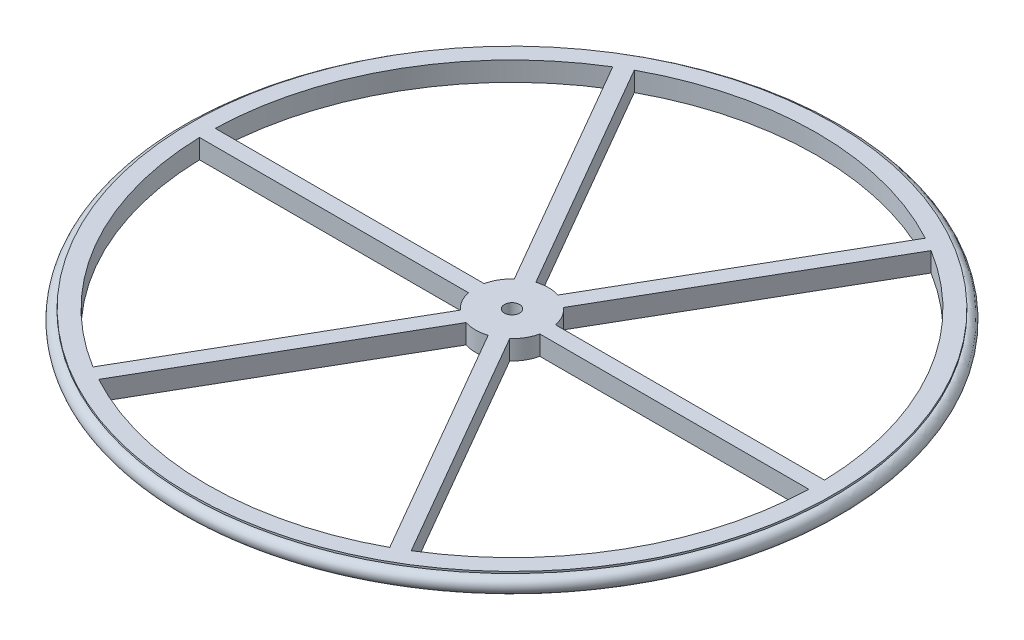
ISO-10303-21;
HEADER;
FILE_DESCRIPTION(('STEP AP214'),'2;1');
FILE_NAME('part.step','',(''),(''),'','','');
FILE_SCHEMA(('AUTOMOTIVE_DESIGN { 1 0 10303 214 1 1 1 1 }'));
ENDSEC;
DATA;
#1=APPLICATION_CONTEXT('core data for automotive mechanical design processes');
#2=APPLICATION_PROTOCOL_DEFINITION('international standard','automotive_design',2000,#1);
#3=PRODUCT_CONTEXT('',#1,'mechanical');
#4=PRODUCT('Part','Part','',(#3));
#5=PRODUCT_RELATED_PRODUCT_CATEGORY('part','',(#4));
#6=PRODUCT_DEFINITION_FORMATION('','',#4);
#7=PRODUCT_DEFINITION_CONTEXT('part definition',#1,'design');
#8=PRODUCT_DEFINITION('design','',#6,#7);
#9=PRODUCT_DEFINITION_SHAPE('','',#8);
#10=(LENGTH_UNIT() NAMED_UNIT(*) SI_UNIT(.MILLI.,.METRE.));
#11=(NAMED_UNIT(*) PLANE_ANGLE_UNIT() SI_UNIT($,.RADIAN.));
#12=(NAMED_UNIT(*) SI_UNIT($,.STERADIAN.) SOLID_ANGLE_UNIT());
#13=UNCERTAINTY_MEASURE_WITH_UNIT(LENGTH_MEASURE(1.E-05),#10,'distance_accuracy_value','');
#14=(GEOMETRIC_REPRESENTATION_CONTEXT(3) GLOBAL_UNCERTAINTY_ASSIGNED_CONTEXT((#13)) GLOBAL_UNIT_ASSIGNED_CONTEXT((#10,
#11,#12)) REPRESENTATION_CONTEXT('',''));
#15=CARTESIAN_POINT('',(0.,0.,0.));
#16=DIRECTION('',(0.,0.,1.));
#17=DIRECTION('',(1.,0.,0.));
#18=AXIS2_PLACEMENT_3D('',#15,#16,#17);
#19=CARTESIAN_POINT('',(0.,10.6,0.));
#20=DIRECTION('',(0.,-1.,0.));
#21=DIRECTION('',(0.,0.,-1.));
#22=AXIS2_PLACEMENT_3D('',#19,#20,#21);
#23=CYLINDRICAL_SURFACE('',#22,175.7);
#24=CARTESIAN_POINT('',(0.,0.999999999999997,0.));
#25=DIRECTION('',(0.,1.,0.));
#26=DIRECTION('',(0.,0.,1.));
#27=AXIS2_PLACEMENT_3D('',#24,#25,#26);
#28=CIRCLE('',#27,175.7);
#29=CARTESIAN_POINT('',(0.,0.999999999999997,175.7));
#30=VERTEX_POINT('',#29);
#31=EDGE_CURVE('E236',#30,#30,#28,.F.);
#32=ORIENTED_EDGE('',*,*,#31,.T.);
#33=EDGE_LOOP('',(#32));
#34=FACE_BOUND('',#33,.T.);
#35=CARTESIAN_POINT('',(0.,0.,0.));
#36=DIRECTION('',(0.,1.,0.));
#37=DIRECTION('',(0.,0.,1.));
#38=AXIS2_PLACEMENT_3D('',#35,#36,#37);
#39=CIRCLE('',#38,175.7);
#40=CARTESIAN_POINT('',(0.,0.,175.7));
#41=VERTEX_POINT('',#40);
#42=EDGE_CURVE('E43',#41,#41,#39,.T.);
#43=ORIENTED_EDGE('',*,*,#42,.T.);
#44=EDGE_LOOP('',(#43));
#45=FACE_BOUND('',#44,.T.);
#46=ADVANCED_FACE('F39',(#34,#45),#23,.T.);
#47=CARTESIAN_POINT('',(0.,10.6,0.));
#48=DIRECTION('',(0.,1.,0.));
#49=DIRECTION('',(0.,0.,1.));
#50=AXIS2_PLACEMENT_3D('',#47,#48,#49);
#51=PLANE('',#50);
#52=CARTESIAN_POINT('',(0.,10.6,0.));
#53=DIRECTION('',(0.,1.,0.));
#54=DIRECTION('',(0.,0.,1.));
#55=AXIS2_PLACEMENT_3D('',#52,#53,#54);
#56=CIRCLE('',#55,175.7);
#57=CARTESIAN_POINT('',(0.,10.6,175.7));
#58=VERTEX_POINT('',#57);
#59=EDGE_CURVE('E11',#58,#58,#56,.T.);
#60=ORIENTED_EDGE('',*,*,#59,.T.);
#61=EDGE_LOOP('',(#60));
#62=FACE_BOUND('',#61,.T.);
#63=CARTESIAN_POINT('',(0.,10.6,0.));
#64=DIRECTION('',(0.,1.,0.));
#65=DIRECTION('',(0.,0.,1.));
#66=AXIS2_PLACEMENT_3D('',#63,#64,#65);
#67=CIRCLE('',#66,4.125);
#68=CARTESIAN_POINT('',(0.,10.6,4.125));
#69=VERTEX_POINT('',#68);
#70=EDGE_CURVE('E467',#69,#69,#67,.T.);
#71=ORIENTED_EDGE('',*,*,#70,.F.);
#72=EDGE_LOOP('',(#71));
#73=FACE_BOUND('',#72,.T.);
#74=DIRECTION('',(-0.5,0.,-0.866025403784439));
#75=VECTOR('',#74,1.);
#76=CARTESIAN_POINT('',(-13.4900497226679,10.6,-14.7654515162912));
#77=LINE('',#76,#75);
#78=CARTESIAN_POINT('',(-13.4900497226679,10.6,-14.7654515162912));
#79=VERTEX_POINT('',#78);
#80=CARTESIAN_POINT('',(-86.9239092362731,10.6,-141.956627189731));
#81=VERTEX_POINT('',#80);
#82=EDGE_CURVE('E427',#79,#81,#77,.T.);
#83=ORIENTED_EDGE('',*,*,#82,.F.);
#84=CARTESIAN_POINT('',(0.,10.6,0.));
#85=DIRECTION('',(0.,-1.,0.));
#86=DIRECTION('',(0.,0.,1.));
#87=AXIS2_PLACEMENT_3D('',#84,#85,#86);
#88=CIRCLE('',#87,20.);
#89=CARTESIAN_POINT('',(-19.5322809727896,10.6,-4.3));
#90=VERTEX_POINT('',#89);
#91=EDGE_CURVE('E424',#90,#79,#88,.T.);
#92=ORIENTED_EDGE('',*,*,#91,.F.);
#93=DIRECTION('',(1.,0.,0.));
#94=VECTOR('',#93,1.);
#95=CARTESIAN_POINT('',(-19.5322809727896,10.6,-4.3));
#96=LINE('',#95,#94);
#97=CARTESIAN_POINT('',(-166.4,10.6,-4.3));
#98=VERTEX_POINT('',#97);
#99=EDGE_CURVE('E435',#98,#90,#96,.T.);
#100=ORIENTED_EDGE('',*,*,#99,.F.);
#101=CARTESIAN_POINT('',(0.,10.6,0.));
#102=DIRECTION('',(0.,1.,0.));
#103=DIRECTION('',(0.,0.,1.));
#104=AXIS2_PLACEMENT_3D('',#101,#102,#103);
#105=CIRCLE('',#104,166.455549622114);
#106=EDGE_CURVE('E431',#81,#98,#105,.T.);
#107=ORIENTED_EDGE('',*,*,#106,.F.);
#108=EDGE_LOOP('',(#83,#92,#100,#107));
#109=FACE_BOUND('',#108,.T.);
#110=DIRECTION('',(-1.,0.,0.));
#111=VECTOR('',#110,1.);
#112=CARTESIAN_POINT('',(-19.5322809727896,10.6,4.3));
#113=LINE('',#112,#111);
#114=CARTESIAN_POINT('',(-19.5322809727896,10.6,4.3));
#115=VERTEX_POINT('',#114);
#116=CARTESIAN_POINT('',(-166.4,10.6,4.3));
#117=VERTEX_POINT('',#116);
#118=EDGE_CURVE('E384',#115,#117,#113,.T.);
#119=ORIENTED_EDGE('',*,*,#118,.F.);
#120=CARTESIAN_POINT('',(0.,10.6,0.));
#121=DIRECTION('',(0.,-1.,0.));
#122=DIRECTION('',(0.,0.,1.));
#123=AXIS2_PLACEMENT_3D('',#120,#121,#122);
#124=CIRCLE('',#123,20.);
#125=CARTESIAN_POINT('',(-13.4900497226679,10.6,14.7654515162913));
#126=VERTEX_POINT('',#125);
#127=EDGE_CURVE('E381',#126,#115,#124,.T.);
#128=ORIENTED_EDGE('',*,*,#127,.F.);
#129=DIRECTION('',(0.499999999999999,0.,-0.866025403784439));
#130=VECTOR('',#129,1.);
#131=CARTESIAN_POINT('',(-13.4900497226679,10.6,14.7654515162913));
#132=LINE('',#131,#130);
#133=CARTESIAN_POINT('',(-86.9239092362729,10.6,141.956627189731));
#134=VERTEX_POINT('',#133);
#135=EDGE_CURVE('E392',#134,#126,#132,.T.);
#136=ORIENTED_EDGE('',*,*,#135,.F.);
#137=CARTESIAN_POINT('',(0.,10.6,0.));
#138=DIRECTION('',(0.,1.,0.));
#139=DIRECTION('',(0.,0.,1.));
#140=AXIS2_PLACEMENT_3D('',#137,#138,#139);
#141=CIRCLE('',#140,166.455549622114);
#142=EDGE_CURVE('E388',#117,#134,#141,.T.);
#143=ORIENTED_EDGE('',*,*,#142,.F.);
#144=EDGE_LOOP('',(#119,#128,#136,#143));
#145=FACE_BOUND('',#144,.T.);
#146=DIRECTION('',(0.5,0.,-0.866025403784439));
#147=VECTOR('',#146,1.);
#148=CARTESIAN_POINT('',(6.04223125012173,10.6,-19.0654515162913));
#149=LINE('',#148,#147);
#150=CARTESIAN_POINT('',(6.04223125012173,10.6,-19.0654515162913));
#151=VERTEX_POINT('',#150);
#152=CARTESIAN_POINT('',(79.4760907637269,10.6,-146.256627189731));
#153=VERTEX_POINT('',#152);
#154=EDGE_CURVE('E341',#151,#153,#149,.T.);
#155=ORIENTED_EDGE('',*,*,#154,.F.);
#156=CARTESIAN_POINT('',(0.,10.6,0.));
#157=DIRECTION('',(0.,-1.,0.));
#158=DIRECTION('',(0.,0.,1.));
#159=AXIS2_PLACEMENT_3D('',#156,#157,#158);
#160=CIRCLE('',#159,20.);
#161=CARTESIAN_POINT('',(-6.04223125012173,10.6,-19.0654515162913));
#162=VERTEX_POINT('',#161);
#163=EDGE_CURVE('E338',#162,#151,#160,.T.);
#164=ORIENTED_EDGE('',*,*,#163,.F.);
#165=DIRECTION('',(0.5,0.,0.866025403784439));
#166=VECTOR('',#165,1.);
#167=CARTESIAN_POINT('',(-6.04223125012173,10.6,-19.0654515162913));
#168=LINE('',#167,#166);
#169=CARTESIAN_POINT('',(-79.4760907637269,10.6,-146.256627189731));
#170=VERTEX_POINT('',#169);
#171=EDGE_CURVE('E349',#170,#162,#168,.T.);
#172=ORIENTED_EDGE('',*,*,#171,.F.);
#173=CARTESIAN_POINT('',(0.,10.6,0.));
#174=DIRECTION('',(0.,1.,0.));
#175=DIRECTION('',(0.,0.,1.));
#176=AXIS2_PLACEMENT_3D('',#173,#174,#175);
#177=CIRCLE('',#176,166.455549622114);
#178=EDGE_CURVE('E345',#153,#170,#177,.T.);
#179=ORIENTED_EDGE('',*,*,#178,.F.);
#180=EDGE_LOOP('',(#155,#164,#172,#179));
#181=FACE_BOUND('',#180,.T.);
#182=DIRECTION('',(-0.5,0.,0.866025403784439));
#183=VECTOR('',#182,1.);
#184=CARTESIAN_POINT('',(13.4900497226679,10.6,-14.7654515162913));
#185=LINE('',#184,#183);
#186=CARTESIAN_POINT('',(86.9239092362731,10.6,-141.956627189731));
#187=VERTEX_POINT('',#186);
#188=CARTESIAN_POINT('',(13.4900497226679,10.6,-14.7654515162913));
#189=VERTEX_POINT('',#188);
#190=EDGE_CURVE('E298',#187,#189,#185,.T.);
#191=ORIENTED_EDGE('',*,*,#190,.F.);
#192=CARTESIAN_POINT('',(0.,10.6,0.));
#193=DIRECTION('',(0.,1.,0.));
#194=DIRECTION('',(0.,0.,-1.));
#195=AXIS2_PLACEMENT_3D('',#192,#193,#194);
#196=CIRCLE('',#195,166.455549622114);
#197=CARTESIAN_POINT('',(166.4,10.6,-4.30000000000002));
#198=VERTEX_POINT('',#197);
#199=EDGE_CURVE('E295',#198,#187,#196,.T.);
#200=ORIENTED_EDGE('',*,*,#199,.F.);
#201=DIRECTION('',(1.,0.,0.));
#202=VECTOR('',#201,1.);
#203=CARTESIAN_POINT('',(19.5322809727896,10.6,-4.3));
#204=LINE('',#203,#202);
#205=CARTESIAN_POINT('',(19.5322809727896,10.6,-4.3));
#206=VERTEX_POINT('',#205);
#207=EDGE_CURVE('E306',#206,#198,#204,.T.);
#208=ORIENTED_EDGE('',*,*,#207,.F.);
#209=CARTESIAN_POINT('',(0.,10.6,0.));
#210=DIRECTION('',(0.,-1.,0.));
#211=DIRECTION('',(0.,0.,1.));
#212=AXIS2_PLACEMENT_3D('',#209,#210,#211);
#213=CIRCLE('',#212,20.);
#214=EDGE_CURVE('E302',#189,#206,#213,.T.);
#215=ORIENTED_EDGE('',*,*,#214,.F.);
#216=EDGE_LOOP('',(#191,#200,#208,#215));
#217=FACE_BOUND('',#216,.T.);
#218=DIRECTION('',(0.5,0.,0.866025403784438));
#219=VECTOR('',#218,1.);
#220=CARTESIAN_POINT('',(13.4900497226679,10.6,14.7654515162912));
#221=LINE('',#220,#219);
#222=CARTESIAN_POINT('',(13.4900497226679,10.6,14.7654515162912));
#223=VERTEX_POINT('',#222);
#224=CARTESIAN_POINT('',(86.9239092362732,10.6,141.956627189731));
#225=VERTEX_POINT('',#224);
#226=EDGE_CURVE('E255',#223,#225,#221,.T.);
#227=ORIENTED_EDGE('',*,*,#226,.F.);
#228=CARTESIAN_POINT('',(0.,10.6,0.));
#229=DIRECTION('',(0.,-1.,0.));
#230=DIRECTION('',(0.,0.,1.));
#231=AXIS2_PLACEMENT_3D('',#228,#229,#230);
#232=CIRCLE('',#231,20.);
#233=CARTESIAN_POINT('',(19.5322809727896,10.6,4.3));
#234=VERTEX_POINT('',#233);
#235=EDGE_CURVE('E252',#234,#223,#232,.T.);
#236=ORIENTED_EDGE('',*,*,#235,.F.);
#237=DIRECTION('',(-1.,0.,0.));
#238=VECTOR('',#237,1.);
#239=CARTESIAN_POINT('',(19.5322809727896,10.6,4.3));
#240=LINE('',#239,#238);
#241=CARTESIAN_POINT('',(166.4,10.6,4.29999999999998));
#242=VERTEX_POINT('',#241);
#243=EDGE_CURVE('E263',#242,#234,#240,.T.);
#244=ORIENTED_EDGE('',*,*,#243,.F.);
#245=CARTESIAN_POINT('',(0.,10.6,0.));
#246=DIRECTION('',(0.,1.,0.));
#247=DIRECTION('',(0.,0.,-1.));
#248=AXIS2_PLACEMENT_3D('',#245,#246,#247);
#249=CIRCLE('',#248,166.455549622114);
#250=EDGE_CURVE('E259',#225,#242,#249,.T.);
#251=ORIENTED_EDGE('',*,*,#250,.F.);
#252=EDGE_LOOP('',(#227,#236,#244,#251));
#253=FACE_BOUND('',#252,.T.);
#254=DIRECTION('',(-0.499999999999999,0.,0.866025403784439));
#255=VECTOR('',#254,1.);
#256=CARTESIAN_POINT('',(-6.04223125012172,10.6,19.0654515162913));
#257=LINE('',#256,#255);
#258=CARTESIAN_POINT('',(-6.04223125012172,10.6,19.0654515162913));
#259=VERTEX_POINT('',#258);
#260=CARTESIAN_POINT('',(-79.4760907637268,10.6,146.256627189731));
#261=VERTEX_POINT('',#260);
#262=EDGE_CURVE('E210',#259,#261,#257,.T.);
#263=ORIENTED_EDGE('',*,*,#262,.F.);
#264=CARTESIAN_POINT('',(0.,10.6,0.));
#265=DIRECTION('',(0.,-1.,0.));
#266=DIRECTION('',(0.,0.,1.));
#267=AXIS2_PLACEMENT_3D('',#264,#265,#266);
#268=CIRCLE('',#267,20.);
#269=CARTESIAN_POINT('',(6.04223125012174,10.6,19.0654515162913));
#270=VERTEX_POINT('',#269);
#271=EDGE_CURVE('E201',#270,#259,#268,.T.);
#272=ORIENTED_EDGE('',*,*,#271,.F.);
#273=DIRECTION('',(-0.5,0.,-0.866025403784438));
#274=VECTOR('',#273,1.);
#275=CARTESIAN_POINT('',(6.04223125012174,10.6,19.0654515162913));
#276=LINE('',#275,#274);
#277=CARTESIAN_POINT('',(79.476090763727,10.6,146.256627189731));
#278=VERTEX_POINT('',#277);
#279=EDGE_CURVE('E228',#278,#270,#276,.T.);
#280=ORIENTED_EDGE('',*,*,#279,.F.);
#281=CARTESIAN_POINT('',(0.,10.6,0.));
#282=DIRECTION('',(0.,1.,0.));
#283=DIRECTION('',(0.,0.,-1.));
#284=AXIS2_PLACEMENT_3D('',#281,#282,#283);
#285=CIRCLE('',#284,166.455549622114);
#286=EDGE_CURVE('E224',#261,#278,#285,.T.);
#287=ORIENTED_EDGE('',*,*,#286,.F.);
#288=EDGE_LOOP('',(#263,#272,#280,#287));
#289=FACE_BOUND('',#288,.T.);
#290=ADVANCED_FACE('F223',(#62,#73,#109,#145,#181,#217,#253,#289),#51,.T.);
#291=CARTESIAN_POINT('',(0.,0.,0.));
#292=DIRECTION('',(0.,1.,0.));
#293=DIRECTION('',(0.,0.,1.));
#294=AXIS2_PLACEMENT_3D('',#291,#292,#293);
#295=PLANE('',#294);
#296=CARTESIAN_POINT('',(0.,0.,0.));
#297=DIRECTION('',(0.,-1.,0.));
#298=DIRECTION('',(0.,0.,1.));
#299=AXIS2_PLACEMENT_3D('',#296,#297,#298);
#300=CIRCLE('',#299,20.);
#301=CARTESIAN_POINT('',(19.5322809727896,0.,4.3));
#302=VERTEX_POINT('',#301);
#303=CARTESIAN_POINT('',(13.4900497226679,0.,14.7654515162912));
#304=VERTEX_POINT('',#303);
#305=EDGE_CURVE('E219',#302,#304,#300,.T.);
#306=ORIENTED_EDGE('',*,*,#305,.T.);
#307=DIRECTION('',(0.5,0.,0.866025403784438));
#308=VECTOR('',#307,1.);
#309=CARTESIAN_POINT('',(13.4900497226679,0.,14.7654515162912));
#310=LINE('',#309,#308);
#311=CARTESIAN_POINT('',(86.9239092362732,0.,141.956627189731));
#312=VERTEX_POINT('',#311);
#313=EDGE_CURVE('E270',#304,#312,#310,.T.);
#314=ORIENTED_EDGE('',*,*,#313,.T.);
#315=CARTESIAN_POINT('',(0.,0.,0.));
#316=DIRECTION('',(0.,1.,0.));
#317=DIRECTION('',(0.,0.,-1.));
#318=AXIS2_PLACEMENT_3D('',#315,#316,#317);
#319=CIRCLE('',#318,166.455549622114);
#320=CARTESIAN_POINT('',(166.4,0.,4.29999999999998));
#321=VERTEX_POINT('',#320);
#322=EDGE_CURVE('E274',#312,#321,#319,.T.);
#323=ORIENTED_EDGE('',*,*,#322,.T.);
#324=DIRECTION('',(-1.,0.,0.));
#325=VECTOR('',#324,1.);
#326=CARTESIAN_POINT('',(19.5322809727896,0.,4.3));
#327=LINE('',#326,#325);
#328=EDGE_CURVE('E256',#321,#302,#327,.T.);
#329=ORIENTED_EDGE('',*,*,#328,.T.);
#330=EDGE_LOOP('',(#306,#314,#323,#329));
#331=FACE_BOUND('',#330,.T.);
#332=CARTESIAN_POINT('',(0.,0.,0.));
#333=DIRECTION('',(0.,-1.,0.));
#334=DIRECTION('',(0.,0.,1.));
#335=AXIS2_PLACEMENT_3D('',#332,#333,#334);
#336=CIRCLE('',#335,20.);
#337=CARTESIAN_POINT('',(-6.04223125012173,0.,-19.0654515162912));
#338=VERTEX_POINT('',#337);
#339=CARTESIAN_POINT('',(6.04223125012173,0.,-19.0654515162913));
#340=VERTEX_POINT('',#339);
#341=EDGE_CURVE('E337',#338,#340,#336,.T.);
#342=ORIENTED_EDGE('',*,*,#341,.T.);
#343=DIRECTION('',(0.5,0.,-0.866025403784439));
#344=VECTOR('',#343,1.);
#345=CARTESIAN_POINT('',(6.04223125012173,0.,-19.0654515162913));
#346=LINE('',#345,#344);
#347=CARTESIAN_POINT('',(79.4760907637269,0.,-146.256627189731));
#348=VERTEX_POINT('',#347);
#349=EDGE_CURVE('E356',#340,#348,#346,.T.);
#350=ORIENTED_EDGE('',*,*,#349,.T.);
#351=CARTESIAN_POINT('',(0.,0.,0.));
#352=DIRECTION('',(0.,1.,0.));
#353=DIRECTION('',(0.,0.,1.));
#354=AXIS2_PLACEMENT_3D('',#351,#352,#353);
#355=CIRCLE('',#354,166.455549622114);
#356=CARTESIAN_POINT('',(-79.476090763727,0.,-146.256627189731));
#357=VERTEX_POINT('',#356);
#358=EDGE_CURVE('E360',#348,#357,#355,.T.);
#359=ORIENTED_EDGE('',*,*,#358,.T.);
#360=DIRECTION('',(0.5,0.,0.866025403784439));
#361=VECTOR('',#360,1.);
#362=CARTESIAN_POINT('',(-6.04223125012173,0.,-19.0654515162913));
#363=LINE('',#362,#361);
#364=EDGE_CURVE('E342',#357,#338,#363,.T.);
#365=ORIENTED_EDGE('',*,*,#364,.T.);
#366=EDGE_LOOP('',(#342,#350,#359,#365));
#367=FACE_BOUND('',#366,.T.);
#368=CARTESIAN_POINT('',(0.,0.,0.));
#369=DIRECTION('',(0.,-1.,0.));
#370=DIRECTION('',(0.,0.,1.));
#371=AXIS2_PLACEMENT_3D('',#368,#369,#370);
#372=CIRCLE('',#371,20.);
#373=CARTESIAN_POINT('',(-19.5322809727896,0.,-4.3));
#374=VERTEX_POINT('',#373);
#375=CARTESIAN_POINT('',(-13.4900497226679,0.,-14.7654515162912));
#376=VERTEX_POINT('',#375);
#377=EDGE_CURVE('E423',#374,#376,#372,.T.);
#378=ORIENTED_EDGE('',*,*,#377,.T.);
#379=DIRECTION('',(-0.5,0.,-0.866025403784439));
#380=VECTOR('',#379,1.);
#381=CARTESIAN_POINT('',(-13.4900497226679,0.,-14.7654515162912));
#382=LINE('',#381,#380);
#383=CARTESIAN_POINT('',(-86.9239092362731,0.,-141.956627189731));
#384=VERTEX_POINT('',#383);
#385=EDGE_CURVE('E442',#376,#384,#382,.T.);
#386=ORIENTED_EDGE('',*,*,#385,.T.);
#387=CARTESIAN_POINT('',(0.,0.,0.));
#388=DIRECTION('',(0.,1.,0.));
#389=DIRECTION('',(0.,0.,1.));
#390=AXIS2_PLACEMENT_3D('',#387,#388,#389);
#391=CIRCLE('',#390,166.455549622114);
#392=CARTESIAN_POINT('',(-166.4,0.,-4.3));
#393=VERTEX_POINT('',#392);
#394=EDGE_CURVE('E446',#384,#393,#391,.T.);
#395=ORIENTED_EDGE('',*,*,#394,.T.);
#396=DIRECTION('',(1.,0.,0.));
#397=VECTOR('',#396,1.);
#398=CARTESIAN_POINT('',(-19.5322809727896,0.,-4.3));
#399=LINE('',#398,#397);
#400=EDGE_CURVE('E428',#393,#374,#399,.T.);
#401=ORIENTED_EDGE('',*,*,#400,.T.);
#402=EDGE_LOOP('',(#378,#386,#395,#401));
#403=FACE_BOUND('',#402,.T.);
#404=ORIENTED_EDGE('',*,*,#42,.F.);
#405=EDGE_LOOP('',(#404));
#406=FACE_BOUND('',#405,.T.);
#407=CARTESIAN_POINT('',(0.,0.,0.));
#408=DIRECTION('',(0.,1.,0.));
#409=DIRECTION('',(0.,0.,1.));
#410=AXIS2_PLACEMENT_3D('',#407,#408,#409);
#411=CIRCLE('',#410,4.125);
#412=CARTESIAN_POINT('',(0.,0.,4.125));
#413=VERTEX_POINT('',#412);
#414=EDGE_CURVE('E466',#413,#413,#411,.T.);
#415=ORIENTED_EDGE('',*,*,#414,.T.);
#416=EDGE_LOOP('',(#415));
#417=FACE_BOUND('',#416,.T.);
#418=CARTESIAN_POINT('',(0.,0.,0.));
#419=DIRECTION('',(0.,-1.,0.));
#420=DIRECTION('',(0.,0.,1.));
#421=AXIS2_PLACEMENT_3D('',#418,#419,#420);
#422=CIRCLE('',#421,20.);
#423=CARTESIAN_POINT('',(-13.4900497226679,0.,14.7654515162913));
#424=VERTEX_POINT('',#423);
#425=CARTESIAN_POINT('',(-19.5322809727896,0.,4.3));
#426=VERTEX_POINT('',#425);
#427=EDGE_CURVE('E380',#424,#426,#422,.T.);
#428=ORIENTED_EDGE('',*,*,#427,.T.);
#429=DIRECTION('',(-1.,0.,0.));
#430=VECTOR('',#429,1.);
#431=CARTESIAN_POINT('',(-19.5322809727896,0.,4.3));
#432=LINE('',#431,#430);
#433=CARTESIAN_POINT('',(-166.4,0.,4.3));
#434=VERTEX_POINT('',#433);
#435=EDGE_CURVE('E399',#426,#434,#432,.T.);
#436=ORIENTED_EDGE('',*,*,#435,.T.);
#437=CARTESIAN_POINT('',(0.,0.,0.));
#438=DIRECTION('',(0.,1.,0.));
#439=DIRECTION('',(0.,0.,1.));
#440=AXIS2_PLACEMENT_3D('',#437,#438,#439);
#441=CIRCLE('',#440,166.455549622114);
#442=CARTESIAN_POINT('',(-86.923909236273,0.,141.956627189731));
#443=VERTEX_POINT('',#442);
#444=EDGE_CURVE('E403',#434,#443,#441,.T.);
#445=ORIENTED_EDGE('',*,*,#444,.T.);
#446=DIRECTION('',(0.499999999999999,0.,-0.866025403784439));
#447=VECTOR('',#446,1.);
#448=CARTESIAN_POINT('',(-13.4900497226679,0.,14.7654515162913));
#449=LINE('',#448,#447);
#450=EDGE_CURVE('E385',#443,#424,#449,.T.);
#451=ORIENTED_EDGE('',*,*,#450,.T.);
#452=EDGE_LOOP('',(#428,#436,#445,#451));
#453=FACE_BOUND('',#452,.T.);
#454=CARTESIAN_POINT('',(0.,0.,0.));
#455=DIRECTION('',(0.,1.,0.));
#456=DIRECTION('',(0.,0.,-1.));
#457=AXIS2_PLACEMENT_3D('',#454,#455,#456);
#458=CIRCLE('',#457,166.455549622114);
#459=CARTESIAN_POINT('',(166.4,0.,-4.30000000000002));
#460=VERTEX_POINT('',#459);
#461=CARTESIAN_POINT('',(86.9239092362731,0.,-141.956627189731));
#462=VERTEX_POINT('',#461);
#463=EDGE_CURVE('E294',#460,#462,#458,.T.);
#464=ORIENTED_EDGE('',*,*,#463,.T.);
#465=DIRECTION('',(-0.5,0.,0.866025403784439));
#466=VECTOR('',#465,1.);
#467=CARTESIAN_POINT('',(13.4900497226679,0.,-14.7654515162913));
#468=LINE('',#467,#466);
#469=CARTESIAN_POINT('',(13.4900497226679,0.,-14.7654515162913));
#470=VERTEX_POINT('',#469);
#471=EDGE_CURVE('E313',#462,#470,#468,.T.);
#472=ORIENTED_EDGE('',*,*,#471,.T.);
#473=CARTESIAN_POINT('',(0.,0.,0.));
#474=DIRECTION('',(0.,-1.,0.));
#475=DIRECTION('',(0.,0.,1.));
#476=AXIS2_PLACEMENT_3D('',#473,#474,#475);
#477=CIRCLE('',#476,20.);
#478=CARTESIAN_POINT('',(19.5322809727896,0.,-4.3));
#479=VERTEX_POINT('',#478);
#480=EDGE_CURVE('E317',#470,#479,#477,.T.);
#481=ORIENTED_EDGE('',*,*,#480,.T.);
#482=DIRECTION('',(1.,0.,0.));
#483=VECTOR('',#482,1.);
#484=CARTESIAN_POINT('',(19.5322809727896,0.,-4.3));
#485=LINE('',#484,#483);
#486=EDGE_CURVE('E299',#479,#460,#485,.T.);
#487=ORIENTED_EDGE('',*,*,#486,.T.);
#488=EDGE_LOOP('',(#464,#472,#481,#487));
#489=FACE_BOUND('',#488,.T.);
#490=CARTESIAN_POINT('',(0.,0.,0.));
#491=DIRECTION('',(0.,-1.,0.));
#492=DIRECTION('',(0.,0.,1.));
#493=AXIS2_PLACEMENT_3D('',#490,#491,#492);
#494=CIRCLE('',#493,20.);
#495=CARTESIAN_POINT('',(6.04223125012174,0.,19.0654515162913));
#496=VERTEX_POINT('',#495);
#497=CARTESIAN_POINT('',(-6.04223125012172,0.,19.0654515162913));
#498=VERTEX_POINT('',#497);
#499=EDGE_CURVE('E63',#496,#498,#494,.T.);
#500=ORIENTED_EDGE('',*,*,#499,.T.);
#501=DIRECTION('',(-0.499999999999999,0.,0.866025403784439));
#502=VECTOR('',#501,1.);
#503=CARTESIAN_POINT('',(-6.04223125012172,0.,19.0654515162913));
#504=LINE('',#503,#502);
#505=CARTESIAN_POINT('',(-79.4760907637268,0.,146.256627189731));
#506=VERTEX_POINT('',#505);
#507=EDGE_CURVE('E217',#498,#506,#504,.T.);
#508=ORIENTED_EDGE('',*,*,#507,.T.);
#509=CARTESIAN_POINT('',(0.,0.,0.));
#510=DIRECTION('',(0.,1.,0.));
#511=DIRECTION('',(0.,0.,-1.));
#512=AXIS2_PLACEMENT_3D('',#509,#510,#511);
#513=CIRCLE('',#512,166.455549622114);
#514=CARTESIAN_POINT('',(79.476090763727,0.,146.256627189731));
#515=VERTEX_POINT('',#514);
#516=EDGE_CURVE('E239',#506,#515,#513,.T.);
#517=ORIENTED_EDGE('',*,*,#516,.T.);
#518=DIRECTION('',(-0.5,0.,-0.866025403784438));
#519=VECTOR('',#518,1.);
#520=CARTESIAN_POINT('',(6.04223125012174,0.,19.0654515162913));
#521=LINE('',#520,#519);
#522=EDGE_CURVE('E211',#515,#496,#521,.T.);
#523=ORIENTED_EDGE('',*,*,#522,.T.);
#524=EDGE_LOOP('',(#500,#508,#517,#523));
#525=FACE_BOUND('',#524,.T.);
#526=ADVANCED_FACE('F475',(#331,#367,#403,#406,#417,#453,#489,#525),#295,.F.);
#527=CARTESIAN_POINT('',(0.,9.6,0.));
#528=DIRECTION('',(0.,-1.,0.));
#529=DIRECTION('',(0.,0.,-1.));
#530=AXIS2_PLACEMENT_3D('',#527,#528,#529);
#531=CIRCLE('',#530,175.7);
#532=CARTESIAN_POINT('',(0.,9.6,-175.7));
#533=VERTEX_POINT('',#532);
#534=EDGE_CURVE('E619',#533,#533,#531,.F.);
#535=ORIENTED_EDGE('',*,*,#534,.T.);
#536=EDGE_LOOP('',(#535));
#537=FACE_BOUND('',#536,.T.);
#538=ORIENTED_EDGE('',*,*,#59,.F.);
#539=EDGE_LOOP('',(#538));
#540=FACE_BOUND('',#539,.T.);
#541=ADVANCED_FACE('F41',(#537,#540),#23,.T.);
#542=CARTESIAN_POINT('',(0.,10.6,0.));
#543=DIRECTION('',(0.,-1.,0.));
#544=DIRECTION('',(0.,0.,-1.));
#545=AXIS2_PLACEMENT_3D('',#542,#543,#544);
#546=CYLINDRICAL_SURFACE('',#545,4.125);
#547=ORIENTED_EDGE('',*,*,#70,.T.);
#548=EDGE_LOOP('',(#547));
#549=FACE_BOUND('',#548,.T.);
#550=ORIENTED_EDGE('',*,*,#414,.F.);
#551=EDGE_LOOP('',(#550));
#552=FACE_BOUND('',#551,.T.);
#553=ADVANCED_FACE('F478',(#549,#552),#546,.F.);
#554=CARTESIAN_POINT('',(0.,10.6,0.));
#555=DIRECTION('',(0.,-1.,0.));
#556=DIRECTION('',(0.,0.,-1.));
#557=AXIS2_PLACEMENT_3D('',#554,#555,#556);
#558=CYLINDRICAL_SURFACE('',#557,20.);
#559=ORIENTED_EDGE('',*,*,#377,.F.);
#560=DIRECTION('',(0.,-1.,0.));
#561=VECTOR('',#560,1.);
#562=CARTESIAN_POINT('',(-19.5322809727896,10.6,-4.3));
#563=LINE('',#562,#561);
#564=EDGE_CURVE('E438',#90,#374,#563,.T.);
#565=ORIENTED_EDGE('',*,*,#564,.F.);
#566=ORIENTED_EDGE('',*,*,#91,.T.);
#567=DIRECTION('',(0.,-1.,0.));
#568=VECTOR('',#567,1.);
#569=CARTESIAN_POINT('',(-13.4900497226679,10.6,-14.7654515162912));
#570=LINE('',#569,#568);
#571=EDGE_CURVE('E462',#79,#376,#570,.T.);
#572=ORIENTED_EDGE('',*,*,#571,.T.);
#573=EDGE_LOOP('',(#559,#565,#566,#572));
#574=FACE_BOUND('',#573,.T.);
#575=ADVANCED_FACE('F480',(#574),#558,.T.);
#576=CARTESIAN_POINT('',(-13.4900497226679,10.6,-14.7654515162912));
#577=DIRECTION('',(-0.866025403784439,0.,0.5));
#578=DIRECTION('',(0.5,0.,0.866025403784439));
#579=AXIS2_PLACEMENT_3D('',#576,#577,#578);
#580=PLANE('',#579);
#581=ORIENTED_EDGE('',*,*,#385,.F.);
#582=ORIENTED_EDGE('',*,*,#571,.F.);
#583=ORIENTED_EDGE('',*,*,#82,.T.);
#584=DIRECTION('',(0.,-1.,0.));
#585=VECTOR('',#584,1.);
#586=CARTESIAN_POINT('',(-86.9239092362731,10.6,-141.956627189731));
#587=LINE('',#586,#585);
#588=EDGE_CURVE('E459',#81,#384,#587,.T.);
#589=ORIENTED_EDGE('',*,*,#588,.T.);
#590=EDGE_LOOP('',(#581,#582,#583,#589));
#591=FACE_BOUND('',#590,.T.);
#592=ADVANCED_FACE('F487',(#591),#580,.T.);
#593=CARTESIAN_POINT('',(0.,10.6,0.));
#594=DIRECTION('',(0.,-1.,0.));
#595=DIRECTION('',(0.,0.,-1.));
#596=AXIS2_PLACEMENT_3D('',#593,#594,#595);
#597=CYLINDRICAL_SURFACE('',#596,166.455549622114);
#598=ORIENTED_EDGE('',*,*,#394,.F.);
#599=ORIENTED_EDGE('',*,*,#588,.F.);
#600=ORIENTED_EDGE('',*,*,#106,.T.);
#601=DIRECTION('',(0.,-1.,0.));
#602=VECTOR('',#601,1.);
#603=CARTESIAN_POINT('',(-166.4,10.6,-4.3));
#604=LINE('',#603,#602);
#605=EDGE_CURVE('E456',#98,#393,#604,.T.);
#606=ORIENTED_EDGE('',*,*,#605,.T.);
#607=EDGE_LOOP('',(#598,#599,#600,#606));
#608=FACE_BOUND('',#607,.T.);
#609=ADVANCED_FACE('F526',(#608),#597,.F.);
#610=CARTESIAN_POINT('',(-19.5322809727896,10.6,-4.3));
#611=DIRECTION('',(0.,0.,-1.));
#612=DIRECTION('',(-1.,0.,0.));
#613=AXIS2_PLACEMENT_3D('',#610,#611,#612);
#614=PLANE('',#613);
#615=ORIENTED_EDGE('',*,*,#400,.F.);
#616=ORIENTED_EDGE('',*,*,#605,.F.);
#617=ORIENTED_EDGE('',*,*,#99,.T.);
#618=ORIENTED_EDGE('',*,*,#564,.T.);
#619=EDGE_LOOP('',(#615,#616,#617,#618));
#620=FACE_BOUND('',#619,.T.);
#621=ADVANCED_FACE('F516',(#620),#614,.T.);
#622=CARTESIAN_POINT('',(0.,10.6,0.));
#623=DIRECTION('',(0.,-1.,0.));
#624=DIRECTION('',(0.,0.,-1.));
#625=AXIS2_PLACEMENT_3D('',#622,#623,#624);
#626=CYLINDRICAL_SURFACE('',#625,20.);
#627=ORIENTED_EDGE('',*,*,#427,.F.);
#628=DIRECTION('',(0.,-1.,0.));
#629=VECTOR('',#628,1.);
#630=CARTESIAN_POINT('',(-13.4900497226679,10.6,14.7654515162913));
#631=LINE('',#630,#629);
#632=EDGE_CURVE('E395',#126,#424,#631,.T.);
#633=ORIENTED_EDGE('',*,*,#632,.F.);
#634=ORIENTED_EDGE('',*,*,#127,.T.);
#635=DIRECTION('',(0.,-1.,0.));
#636=VECTOR('',#635,1.);
#637=CARTESIAN_POINT('',(-19.5322809727896,10.6,4.3));
#638=LINE('',#637,#636);
#639=EDGE_CURVE('E419',#115,#426,#638,.T.);
#640=ORIENTED_EDGE('',*,*,#639,.T.);
#641=EDGE_LOOP('',(#627,#633,#634,#640));
#642=FACE_BOUND('',#641,.T.);
#643=ADVANCED_FACE('F533',(#642),#626,.T.);
#644=CARTESIAN_POINT('',(-19.5322809727896,10.6,4.3));
#645=DIRECTION('',(0.,0.,1.));
#646=DIRECTION('',(1.,0.,0.));
#647=AXIS2_PLACEMENT_3D('',#644,#645,#646);
#648=PLANE('',#647);
#649=ORIENTED_EDGE('',*,*,#435,.F.);
#650=ORIENTED_EDGE('',*,*,#639,.F.);
#651=ORIENTED_EDGE('',*,*,#118,.T.);
#652=DIRECTION('',(0.,-1.,0.));
#653=VECTOR('',#652,1.);
#654=CARTESIAN_POINT('',(-166.4,10.6,4.3));
#655=LINE('',#654,#653);
#656=EDGE_CURVE('E416',#117,#434,#655,.T.);
#657=ORIENTED_EDGE('',*,*,#656,.T.);
#658=EDGE_LOOP('',(#649,#650,#651,#657));
#659=FACE_BOUND('',#658,.T.);
#660=ADVANCED_FACE('F539',(#659),#648,.T.);
#661=CARTESIAN_POINT('',(0.,10.6,0.));
#662=DIRECTION('',(0.,-1.,0.));
#663=DIRECTION('',(0.,0.,-1.));
#664=AXIS2_PLACEMENT_3D('',#661,#662,#663);
#665=CYLINDRICAL_SURFACE('',#664,166.455549622114);
#666=ORIENTED_EDGE('',*,*,#444,.F.);
#667=ORIENTED_EDGE('',*,*,#656,.F.);
#668=ORIENTED_EDGE('',*,*,#142,.T.);
#669=DIRECTION('',(0.,-1.,0.));
#670=VECTOR('',#669,1.);
#671=CARTESIAN_POINT('',(-86.923909236273,10.6,141.956627189731));
#672=LINE('',#671,#670);
#673=EDGE_CURVE('E413',#134,#443,#672,.T.);
#674=ORIENTED_EDGE('',*,*,#673,.T.);
#675=EDGE_LOOP('',(#666,#667,#668,#674));
#676=FACE_BOUND('',#675,.T.);
#677=ADVANCED_FACE('F543',(#676),#665,.F.);
#678=CARTESIAN_POINT('',(-13.4900497226679,10.6,14.7654515162913));
#679=DIRECTION('',(-0.866025403784439,0.,-0.499999999999999));
#680=DIRECTION('',(-0.499999999999999,0.,0.866025403784439));
#681=AXIS2_PLACEMENT_3D('',#678,#679,#680);
#682=PLANE('',#681);
#683=ORIENTED_EDGE('',*,*,#450,.F.);
#684=ORIENTED_EDGE('',*,*,#673,.F.);
#685=ORIENTED_EDGE('',*,*,#135,.T.);
#686=ORIENTED_EDGE('',*,*,#632,.T.);
#687=EDGE_LOOP('',(#683,#684,#685,#686));
#688=FACE_BOUND('',#687,.T.);
#689=ADVANCED_FACE('F547',(#688),#682,.T.);
#690=CARTESIAN_POINT('',(0.,10.6,0.));
#691=DIRECTION('',(0.,-1.,0.));
#692=DIRECTION('',(0.,0.,-1.));
#693=AXIS2_PLACEMENT_3D('',#690,#691,#692);
#694=CYLINDRICAL_SURFACE('',#693,20.);
#695=ORIENTED_EDGE('',*,*,#341,.F.);
#696=DIRECTION('',(0.,-1.,0.));
#697=VECTOR('',#696,1.);
#698=CARTESIAN_POINT('',(-6.04223125012173,10.6,-19.0654515162913));
#699=LINE('',#698,#697);
#700=EDGE_CURVE('E352',#162,#338,#699,.T.);
#701=ORIENTED_EDGE('',*,*,#700,.F.);
#702=ORIENTED_EDGE('',*,*,#163,.T.);
#703=DIRECTION('',(0.,-1.,0.));
#704=VECTOR('',#703,1.);
#705=CARTESIAN_POINT('',(6.04223125012173,10.6,-19.0654515162913));
#706=LINE('',#705,#704);
#707=EDGE_CURVE('E376',#151,#340,#706,.T.);
#708=ORIENTED_EDGE('',*,*,#707,.T.);
#709=EDGE_LOOP('',(#695,#701,#702,#708));
#710=FACE_BOUND('',#709,.T.);
#711=ADVANCED_FACE('F551',(#710),#694,.T.);
#712=CARTESIAN_POINT('',(6.04223125012173,10.6,-19.0654515162913));
#713=DIRECTION('',(-0.866025403784439,0.,-0.5));
#714=DIRECTION('',(-0.5,0.,0.866025403784439));
#715=AXIS2_PLACEMENT_3D('',#712,#713,#714);
#716=PLANE('',#715);
#717=ORIENTED_EDGE('',*,*,#349,.F.);
#718=ORIENTED_EDGE('',*,*,#707,.F.);
#719=ORIENTED_EDGE('',*,*,#154,.T.);
#720=DIRECTION('',(0.,-1.,0.));
#721=VECTOR('',#720,1.);
#722=CARTESIAN_POINT('',(79.4760907637269,10.6,-146.256627189731));
#723=LINE('',#722,#721);
#724=EDGE_CURVE('E373',#153,#348,#723,.T.);
#725=ORIENTED_EDGE('',*,*,#724,.T.);
#726=EDGE_LOOP('',(#717,#718,#719,#725));
#727=FACE_BOUND('',#726,.T.);
#728=ADVANCED_FACE('F555',(#727),#716,.T.);
#729=CARTESIAN_POINT('',(0.,10.6,0.));
#730=DIRECTION('',(0.,-1.,0.));
#731=DIRECTION('',(0.,0.,-1.));
#732=AXIS2_PLACEMENT_3D('',#729,#730,#731);
#733=CYLINDRICAL_SURFACE('',#732,166.455549622114);
#734=ORIENTED_EDGE('',*,*,#358,.F.);
#735=ORIENTED_EDGE('',*,*,#724,.F.);
#736=ORIENTED_EDGE('',*,*,#178,.T.);
#737=DIRECTION('',(0.,-1.,0.));
#738=VECTOR('',#737,1.);
#739=CARTESIAN_POINT('',(-79.476090763727,10.6,-146.256627189731));
#740=LINE('',#739,#738);
#741=EDGE_CURVE('E370',#170,#357,#740,.T.);
#742=ORIENTED_EDGE('',*,*,#741,.T.);
#743=EDGE_LOOP('',(#734,#735,#736,#742));
#744=FACE_BOUND('',#743,.T.);
#745=ADVANCED_FACE('F559',(#744),#733,.F.);
#746=CARTESIAN_POINT('',(-6.04223125012173,10.6,-19.0654515162913));
#747=DIRECTION('',(0.866025403784439,0.,-0.5));
#748=DIRECTION('',(-0.5,0.,-0.866025403784439));
#749=AXIS2_PLACEMENT_3D('',#746,#747,#748);
#750=PLANE('',#749);
#751=ORIENTED_EDGE('',*,*,#364,.F.);
#752=ORIENTED_EDGE('',*,*,#741,.F.);
#753=ORIENTED_EDGE('',*,*,#171,.T.);
#754=ORIENTED_EDGE('',*,*,#700,.T.);
#755=EDGE_LOOP('',(#751,#752,#753,#754));
#756=FACE_BOUND('',#755,.T.);
#757=ADVANCED_FACE('F563',(#756),#750,.T.);
#758=CARTESIAN_POINT('',(0.,10.6,0.));
#759=DIRECTION('',(0.,-1.,0.));
#760=DIRECTION('',(0.,0.,-1.));
#761=AXIS2_PLACEMENT_3D('',#758,#759,#760);
#762=CYLINDRICAL_SURFACE('',#761,166.455549622114);
#763=ORIENTED_EDGE('',*,*,#463,.F.);
#764=DIRECTION('',(0.,-1.,0.));
#765=VECTOR('',#764,1.);
#766=CARTESIAN_POINT('',(166.4,10.6,-4.30000000000002));
#767=LINE('',#766,#765);
#768=EDGE_CURVE('E309',#198,#460,#767,.T.);
#769=ORIENTED_EDGE('',*,*,#768,.F.);
#770=ORIENTED_EDGE('',*,*,#199,.T.);
#771=DIRECTION('',(0.,-1.,0.));
#772=VECTOR('',#771,1.);
#773=CARTESIAN_POINT('',(86.9239092362731,10.6,-141.956627189731));
#774=LINE('',#773,#772);
#775=EDGE_CURVE('E333',#187,#462,#774,.T.);
#776=ORIENTED_EDGE('',*,*,#775,.T.);
#777=EDGE_LOOP('',(#763,#769,#770,#776));
#778=FACE_BOUND('',#777,.T.);
#779=ADVANCED_FACE('F567',(#778),#762,.F.);
#780=CARTESIAN_POINT('',(13.4900497226679,10.6,-14.7654515162913));
#781=DIRECTION('',(0.866025403784439,0.,0.5));
#782=DIRECTION('',(0.5,0.,-0.866025403784439));
#783=AXIS2_PLACEMENT_3D('',#780,#781,#782);
#784=PLANE('',#783);
#785=ORIENTED_EDGE('',*,*,#471,.F.);
#786=ORIENTED_EDGE('',*,*,#775,.F.);
#787=ORIENTED_EDGE('',*,*,#190,.T.);
#788=DIRECTION('',(0.,-1.,0.));
#789=VECTOR('',#788,1.);
#790=CARTESIAN_POINT('',(13.4900497226679,10.6,-14.7654515162913));
#791=LINE('',#790,#789);
#792=EDGE_CURVE('E330',#189,#470,#791,.T.);
#793=ORIENTED_EDGE('',*,*,#792,.T.);
#794=EDGE_LOOP('',(#785,#786,#787,#793));
#795=FACE_BOUND('',#794,.T.);
#796=ADVANCED_FACE('F571',(#795),#784,.T.);
#797=CARTESIAN_POINT('',(0.,10.6,0.));
#798=DIRECTION('',(0.,-1.,0.));
#799=DIRECTION('',(0.,0.,-1.));
#800=AXIS2_PLACEMENT_3D('',#797,#798,#799);
#801=CYLINDRICAL_SURFACE('',#800,20.);
#802=ORIENTED_EDGE('',*,*,#480,.F.);
#803=ORIENTED_EDGE('',*,*,#792,.F.);
#804=ORIENTED_EDGE('',*,*,#214,.T.);
#805=DIRECTION('',(0.,-1.,0.));
#806=VECTOR('',#805,1.);
#807=CARTESIAN_POINT('',(19.5322809727896,10.6,-4.3));
#808=LINE('',#807,#806);
#809=EDGE_CURVE('E327',#206,#479,#808,.T.);
#810=ORIENTED_EDGE('',*,*,#809,.T.);
#811=EDGE_LOOP('',(#802,#803,#804,#810));
#812=FACE_BOUND('',#811,.T.);
#813=ADVANCED_FACE('F575',(#812),#801,.T.);
#814=CARTESIAN_POINT('',(19.5322809727896,10.6,-4.3));
#815=DIRECTION('',(0.,0.,-1.));
#816=DIRECTION('',(-1.,0.,0.));
#817=AXIS2_PLACEMENT_3D('',#814,#815,#816);
#818=PLANE('',#817);
#819=ORIENTED_EDGE('',*,*,#486,.F.);
#820=ORIENTED_EDGE('',*,*,#809,.F.);
#821=ORIENTED_EDGE('',*,*,#207,.T.);
#822=ORIENTED_EDGE('',*,*,#768,.T.);
#823=EDGE_LOOP('',(#819,#820,#821,#822));
#824=FACE_BOUND('',#823,.T.);
#825=ADVANCED_FACE('F579',(#824),#818,.T.);
#826=CARTESIAN_POINT('',(0.,10.6,0.));
#827=DIRECTION('',(0.,-1.,0.));
#828=DIRECTION('',(0.,0.,-1.));
#829=AXIS2_PLACEMENT_3D('',#826,#827,#828);
#830=CYLINDRICAL_SURFACE('',#829,20.);
#831=ORIENTED_EDGE('',*,*,#305,.F.);
#832=DIRECTION('',(0.,-1.,0.));
#833=VECTOR('',#832,1.);
#834=CARTESIAN_POINT('',(19.5322809727896,10.6,4.3));
#835=LINE('',#834,#833);
#836=EDGE_CURVE('E266',#234,#302,#835,.T.);
#837=ORIENTED_EDGE('',*,*,#836,.F.);
#838=ORIENTED_EDGE('',*,*,#235,.T.);
#839=DIRECTION('',(0.,-1.,0.));
#840=VECTOR('',#839,1.);
#841=CARTESIAN_POINT('',(13.4900497226679,10.6,14.7654515162912));
#842=LINE('',#841,#840);
#843=EDGE_CURVE('E290',#223,#304,#842,.T.);
#844=ORIENTED_EDGE('',*,*,#843,.T.);
#845=EDGE_LOOP('',(#831,#837,#838,#844));
#846=FACE_BOUND('',#845,.T.);
#847=ADVANCED_FACE('F583',(#846),#830,.T.);
#848=CARTESIAN_POINT('',(13.4900497226679,10.6,14.7654515162912));
#849=DIRECTION('',(0.866025403784438,0.,-0.5));
#850=DIRECTION('',(-0.5,0.,-0.866025403784438));
#851=AXIS2_PLACEMENT_3D('',#848,#849,#850);
#852=PLANE('',#851);
#853=ORIENTED_EDGE('',*,*,#313,.F.);
#854=ORIENTED_EDGE('',*,*,#843,.F.);
#855=ORIENTED_EDGE('',*,*,#226,.T.);
#856=DIRECTION('',(0.,-1.,0.));
#857=VECTOR('',#856,1.);
#858=CARTESIAN_POINT('',(86.9239092362732,10.6,141.956627189731));
#859=LINE('',#858,#857);
#860=EDGE_CURVE('E287',#225,#312,#859,.T.);
#861=ORIENTED_EDGE('',*,*,#860,.T.);
#862=EDGE_LOOP('',(#853,#854,#855,#861));
#863=FACE_BOUND('',#862,.T.);
#864=ADVANCED_FACE('F587',(#863),#852,.T.);
#865=CARTESIAN_POINT('',(0.,10.6,0.));
#866=DIRECTION('',(0.,-1.,0.));
#867=DIRECTION('',(0.,0.,-1.));
#868=AXIS2_PLACEMENT_3D('',#865,#866,#867);
#869=CYLINDRICAL_SURFACE('',#868,166.455549622114);
#870=ORIENTED_EDGE('',*,*,#322,.F.);
#871=ORIENTED_EDGE('',*,*,#860,.F.);
#872=ORIENTED_EDGE('',*,*,#250,.T.);
#873=DIRECTION('',(0.,-1.,0.));
#874=VECTOR('',#873,1.);
#875=CARTESIAN_POINT('',(166.4,10.6,4.29999999999998));
#876=LINE('',#875,#874);
#877=EDGE_CURVE('E284',#242,#321,#876,.T.);
#878=ORIENTED_EDGE('',*,*,#877,.T.);
#879=EDGE_LOOP('',(#870,#871,#872,#878));
#880=FACE_BOUND('',#879,.T.);
#881=ADVANCED_FACE('F591',(#880),#869,.F.);
#882=CARTESIAN_POINT('',(19.5322809727896,10.6,4.3));
#883=DIRECTION('',(0.,0.,1.));
#884=DIRECTION('',(1.,0.,0.));
#885=AXIS2_PLACEMENT_3D('',#882,#883,#884);
#886=PLANE('',#885);
#887=ORIENTED_EDGE('',*,*,#328,.F.);
#888=ORIENTED_EDGE('',*,*,#877,.F.);
#889=ORIENTED_EDGE('',*,*,#243,.T.);
#890=ORIENTED_EDGE('',*,*,#836,.T.);
#891=EDGE_LOOP('',(#887,#888,#889,#890));
#892=FACE_BOUND('',#891,.T.);
#893=ADVANCED_FACE('F595',(#892),#886,.T.);
#894=CARTESIAN_POINT('',(0.,10.6,0.));
#895=DIRECTION('',(0.,-1.,0.));
#896=DIRECTION('',(0.,0.,-1.));
#897=AXIS2_PLACEMENT_3D('',#894,#895,#896);
#898=CYLINDRICAL_SURFACE('',#897,20.);
#899=ORIENTED_EDGE('',*,*,#499,.F.);
#900=DIRECTION('',(0.,-1.,0.));
#901=VECTOR('',#900,1.);
#902=CARTESIAN_POINT('',(6.04223125012174,10.6,19.0654515162913));
#903=LINE('',#902,#901);
#904=EDGE_CURVE('E205',#270,#496,#903,.T.);
#905=ORIENTED_EDGE('',*,*,#904,.F.);
#906=ORIENTED_EDGE('',*,*,#271,.T.);
#907=DIRECTION('',(0.,-1.,0.));
#908=VECTOR('',#907,1.);
#909=CARTESIAN_POINT('',(-6.04223125012172,10.6,19.0654515162913));
#910=LINE('',#909,#908);
#911=EDGE_CURVE('E204',#259,#498,#910,.T.);
#912=ORIENTED_EDGE('',*,*,#911,.T.);
#913=EDGE_LOOP('',(#899,#905,#906,#912));
#914=FACE_BOUND('',#913,.T.);
#915=ADVANCED_FACE('F203',(#914),#898,.T.);
#916=CARTESIAN_POINT('',(-6.04223125012172,10.6,19.0654515162913));
#917=DIRECTION('',(0.866025403784439,0.,0.499999999999999));
#918=DIRECTION('',(0.5,0.,-0.866025403784439));
#919=AXIS2_PLACEMENT_3D('',#916,#917,#918);
#920=PLANE('',#919);
#921=ORIENTED_EDGE('',*,*,#507,.F.);
#922=ORIENTED_EDGE('',*,*,#911,.F.);
#923=ORIENTED_EDGE('',*,*,#262,.T.);
#924=DIRECTION('',(0.,-1.,0.));
#925=VECTOR('',#924,1.);
#926=CARTESIAN_POINT('',(-79.4760907637268,10.6,146.256627189731));
#927=LINE('',#926,#925);
#928=EDGE_CURVE('E220',#261,#506,#927,.T.);
#929=ORIENTED_EDGE('',*,*,#928,.T.);
#930=EDGE_LOOP('',(#921,#922,#923,#929));
#931=FACE_BOUND('',#930,.T.);
#932=ADVANCED_FACE('F214',(#931),#920,.T.);
#933=CARTESIAN_POINT('',(0.,10.6,0.));
#934=DIRECTION('',(0.,-1.,0.));
#935=DIRECTION('',(0.,0.,-1.));
#936=AXIS2_PLACEMENT_3D('',#933,#934,#935);
#937=CYLINDRICAL_SURFACE('',#936,166.455549622114);
#938=ORIENTED_EDGE('',*,*,#516,.F.);
#939=ORIENTED_EDGE('',*,*,#928,.F.);
#940=ORIENTED_EDGE('',*,*,#286,.T.);
#941=DIRECTION('',(0.,-1.,0.));
#942=VECTOR('',#941,1.);
#943=CARTESIAN_POINT('',(79.476090763727,10.6,146.256627189731));
#944=LINE('',#943,#942);
#945=EDGE_CURVE('E55',#278,#515,#944,.T.);
#946=ORIENTED_EDGE('',*,*,#945,.T.);
#947=EDGE_LOOP('',(#938,#939,#940,#946));
#948=FACE_BOUND('',#947,.T.);
#949=ADVANCED_FACE('F604',(#948),#937,.F.);
#950=CARTESIAN_POINT('',(6.04223125012174,10.6,19.0654515162913));
#951=DIRECTION('',(-0.866025403784438,0.,0.5));
#952=DIRECTION('',(0.5,0.,0.866025403784438));
#953=AXIS2_PLACEMENT_3D('',#950,#951,#952);
#954=PLANE('',#953);
#955=ORIENTED_EDGE('',*,*,#522,.F.);
#956=ORIENTED_EDGE('',*,*,#945,.F.);
#957=ORIENTED_EDGE('',*,*,#279,.T.);
#958=ORIENTED_EDGE('',*,*,#904,.T.);
#959=EDGE_LOOP('',(#955,#956,#957,#958));
#960=FACE_BOUND('',#959,.T.);
#961=ADVANCED_FACE('F607',(#960),#954,.T.);
#962=CARTESIAN_POINT('',(0.,5.3,0.));
#963=DIRECTION('',(0.,-1.,0.));
#964=DIRECTION('',(0.,0.,-1.));
#965=AXIS2_PLACEMENT_3D('',#962,#963,#964);
#966=TOROIDAL_SURFACE('',#965,175.7,4.3);
#967=ORIENTED_EDGE('',*,*,#31,.F.);
#968=EDGE_LOOP('',(#967));
#969=FACE_BOUND('',#968,.T.);
#970=ORIENTED_EDGE('',*,*,#534,.F.);
#971=EDGE_LOOP('',(#970));
#972=FACE_BOUND('',#971,.T.);
#973=ADVANCED_FACE('F611',(#969,#972),#966,.T.);
#974=CLOSED_SHELL('',(#46,#290,#526,#541,#553,#575,#592,#609,#621,#643,#660,#677,#689,#711,#728,
#745,#757,#779,#796,#813,#825,#847,#864,#881,#893,#915,#932,#949,#961,#973));
#975=MANIFOLD_SOLID_BREP('B2',#974);
#976=ADVANCED_BREP_SHAPE_REPRESENTATION('',(#18,#975),#14);
#977=SHAPE_DEFINITION_REPRESENTATION(#9,#976);
ENDSEC;
END-ISO-10303-21;
